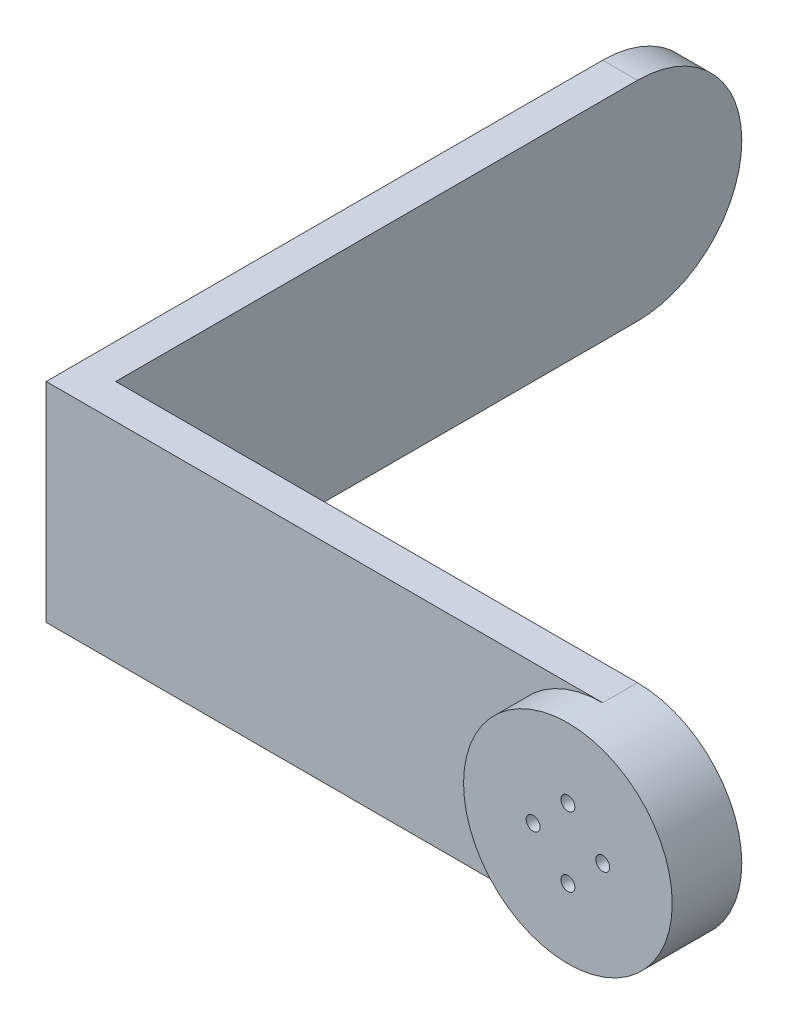
ISO-10303-21;
HEADER;
FILE_DESCRIPTION(('STEP AP214'),'2;1');
FILE_NAME('part.step','',(''),(''),'','','');
FILE_SCHEMA(('AUTOMOTIVE_DESIGN { 1 0 10303 214 1 1 1 1 }'));
ENDSEC;
DATA;
#1=APPLICATION_CONTEXT('core data for automotive mechanical design processes');
#2=APPLICATION_PROTOCOL_DEFINITION('international standard','automotive_design',2000,#1);
#3=PRODUCT_CONTEXT('',#1,'mechanical');
#4=PRODUCT('Part','Part','',(#3));
#5=PRODUCT_RELATED_PRODUCT_CATEGORY('part','',(#4));
#6=PRODUCT_DEFINITION_FORMATION('','',#4);
#7=PRODUCT_DEFINITION_CONTEXT('part definition',#1,'design');
#8=PRODUCT_DEFINITION('design','',#6,#7);
#9=PRODUCT_DEFINITION_SHAPE('','',#8);
#10=(LENGTH_UNIT() NAMED_UNIT(*) SI_UNIT(.MILLI.,.METRE.));
#11=(NAMED_UNIT(*) PLANE_ANGLE_UNIT() SI_UNIT($,.RADIAN.));
#12=(NAMED_UNIT(*) SI_UNIT($,.STERADIAN.) SOLID_ANGLE_UNIT());
#13=UNCERTAINTY_MEASURE_WITH_UNIT(LENGTH_MEASURE(1.E-05),#10,'distance_accuracy_value','');
#14=(GEOMETRIC_REPRESENTATION_CONTEXT(3) GLOBAL_UNCERTAINTY_ASSIGNED_CONTEXT((#13)) GLOBAL_UNIT_ASSIGNED_CONTEXT((#10,
#11,#12)) REPRESENTATION_CONTEXT('',''));
#15=CARTESIAN_POINT('',(0.,0.,0.));
#16=DIRECTION('',(0.,0.,1.));
#17=DIRECTION('',(1.,0.,0.));
#18=AXIS2_PLACEMENT_3D('',#15,#16,#17);
#19=CARTESIAN_POINT('',(0.,0.,-5.));
#20=DIRECTION('',(0.,0.,1.));
#21=DIRECTION('',(1.,0.,0.));
#22=AXIS2_PLACEMENT_3D('',#19,#20,#21);
#23=PLANE('',#22);
#24=CARTESIAN_POINT('',(-5.,0.,-5.));
#25=DIRECTION('',(0.,0.,1.));
#26=DIRECTION('',(1.,0.,0.));
#27=AXIS2_PLACEMENT_3D('',#24,#25,#26);
#28=CIRCLE('',#27,1.);
#29=CARTESIAN_POINT('',(-4.,0.,-5.));
#30=VERTEX_POINT('',#29);
#31=EDGE_CURVE('E140',#30,#30,#28,.T.);
#32=ORIENTED_EDGE('',*,*,#31,.T.);
#33=EDGE_LOOP('',(#32));
#34=FACE_BOUND('',#33,.T.);
#35=CARTESIAN_POINT('',(0.,-5.,-5.));
#36=DIRECTION('',(0.,0.,1.));
#37=DIRECTION('',(1.,0.,0.));
#38=AXIS2_PLACEMENT_3D('',#35,#36,#37);
#39=CIRCLE('',#38,1.);
#40=CARTESIAN_POINT('',(1.,-5.,-5.));
#41=VERTEX_POINT('',#40);
#42=EDGE_CURVE('E149',#41,#41,#39,.T.);
#43=ORIENTED_EDGE('',*,*,#42,.T.);
#44=EDGE_LOOP('',(#43));
#45=FACE_BOUND('',#44,.T.);
#46=CARTESIAN_POINT('',(5.,0.,-5.));
#47=DIRECTION('',(0.,0.,1.));
#48=DIRECTION('',(1.,0.,0.));
#49=AXIS2_PLACEMENT_3D('',#46,#47,#48);
#50=CIRCLE('',#49,1.);
#51=CARTESIAN_POINT('',(6.,0.,-5.));
#52=VERTEX_POINT('',#51);
#53=EDGE_CURVE('E157',#52,#52,#50,.T.);
#54=ORIENTED_EDGE('',*,*,#53,.T.);
#55=EDGE_LOOP('',(#54));
#56=FACE_BOUND('',#55,.T.);
#57=CARTESIAN_POINT('',(0.,5.,-5.));
#58=DIRECTION('',(0.,0.,1.));
#59=DIRECTION('',(1.,0.,0.));
#60=AXIS2_PLACEMENT_3D('',#57,#58,#59);
#61=CIRCLE('',#60,1.);
#62=CARTESIAN_POINT('',(1.,5.,-5.));
#63=VERTEX_POINT('',#62);
#64=EDGE_CURVE('E92',#63,#63,#61,.T.);
#65=ORIENTED_EDGE('',*,*,#64,.T.);
#66=EDGE_LOOP('',(#65));
#67=FACE_BOUND('',#66,.T.);
#68=DIRECTION('',(0.,-1.,0.));
#69=VECTOR('',#68,1.);
#70=CARTESIAN_POINT('',(-75.,0.,-5.));
#71=LINE('',#70,#69);
#72=CARTESIAN_POINT('',(-75.,15.,-5.));
#73=VERTEX_POINT('',#72);
#74=CARTESIAN_POINT('',(-75.,-15.,-5.));
#75=VERTEX_POINT('',#74);
#76=EDGE_CURVE('E11',#73,#75,#71,.T.);
#77=ORIENTED_EDGE('',*,*,#76,.F.);
#78=DIRECTION('',(-1.,0.,0.));
#79=VECTOR('',#78,1.);
#80=CARTESIAN_POINT('',(0.,15.,-5.));
#81=LINE('',#80,#79);
#82=CARTESIAN_POINT('',(0.,15.,-5.));
#83=VERTEX_POINT('',#82);
#84=EDGE_CURVE('E123',#83,#73,#81,.T.);
#85=ORIENTED_EDGE('',*,*,#84,.F.);
#86=CARTESIAN_POINT('',(0.,0.,-5.));
#87=DIRECTION('',(0.,0.,1.));
#88=DIRECTION('',(1.,0.,0.));
#89=AXIS2_PLACEMENT_3D('',#86,#87,#88);
#90=CIRCLE('',#89,15.);
#91=CARTESIAN_POINT('',(0.,-15.,-5.));
#92=VERTEX_POINT('',#91);
#93=EDGE_CURVE('E113',#92,#83,#90,.T.);
#94=ORIENTED_EDGE('',*,*,#93,.F.);
#95=DIRECTION('',(-1.,0.,0.));
#96=VECTOR('',#95,1.);
#97=CARTESIAN_POINT('',(0.,-15.,-5.));
#98=LINE('',#97,#96);
#99=EDGE_CURVE('E108',#92,#75,#98,.T.);
#100=ORIENTED_EDGE('',*,*,#99,.T.);
#101=EDGE_LOOP('',(#77,#85,#94,#100));
#102=FACE_BOUND('',#101,.T.);
#103=ADVANCED_FACE('F41',(#34,#45,#56,#67,#102),#23,.F.);
#104=CARTESIAN_POINT('',(0.,0.,5.));
#105=DIRECTION('',(0.,0.,-1.));
#106=DIRECTION('',(-1.,0.,0.));
#107=AXIS2_PLACEMENT_3D('',#104,#105,#106);
#108=CYLINDRICAL_SURFACE('',#107,15.);
#109=CARTESIAN_POINT('',(0.,0.,5.));
#110=DIRECTION('',(0.,0.,1.));
#111=DIRECTION('',(1.,0.,0.));
#112=AXIS2_PLACEMENT_3D('',#109,#110,#111);
#113=CIRCLE('',#112,15.);
#114=CARTESIAN_POINT('',(15.,0.,5.));
#115=VERTEX_POINT('',#114);
#116=EDGE_CURVE('E50',#115,#115,#113,.T.);
#117=ORIENTED_EDGE('',*,*,#116,.F.);
#118=EDGE_LOOP('',(#117));
#119=FACE_BOUND('',#118,.T.);
#120=CARTESIAN_POINT('',(0.,0.,0.));
#121=DIRECTION('',(0.,0.,1.));
#122=DIRECTION('',(1.,0.,0.));
#123=AXIS2_PLACEMENT_3D('',#120,#121,#122);
#124=CIRCLE('',#123,15.);
#125=CARTESIAN_POINT('',(0.,15.,0.));
#126=VERTEX_POINT('',#125);
#127=CARTESIAN_POINT('',(0.,-15.,0.));
#128=VERTEX_POINT('',#127);
#129=EDGE_CURVE('E103',#126,#128,#124,.T.);
#130=ORIENTED_EDGE('',*,*,#129,.T.);
#131=DIRECTION('',(0.,0.,1.));
#132=VECTOR('',#131,1.);
#133=CARTESIAN_POINT('',(0.,-15.,-5.));
#134=LINE('',#133,#132);
#135=EDGE_CURVE('E86',#92,#128,#134,.T.);
#136=ORIENTED_EDGE('',*,*,#135,.F.);
#137=ORIENTED_EDGE('',*,*,#93,.T.);
#138=DIRECTION('',(0.,0.,1.));
#139=VECTOR('',#138,1.);
#140=CARTESIAN_POINT('',(0.,15.,-5.));
#141=LINE('',#140,#139);
#142=EDGE_CURVE('E62',#83,#126,#141,.T.);
#143=ORIENTED_EDGE('',*,*,#142,.T.);
#144=EDGE_LOOP('',(#130,#136,#137,#143));
#145=FACE_BOUND('',#144,.T.);
#146=ADVANCED_FACE('F43',(#119,#145),#108,.T.);
#147=CARTESIAN_POINT('',(0.,0.,5.));
#148=DIRECTION('',(0.,0.,1.));
#149=DIRECTION('',(1.,0.,0.));
#150=AXIS2_PLACEMENT_3D('',#147,#148,#149);
#151=PLANE('',#150);
#152=CARTESIAN_POINT('',(0.,5.,5.));
#153=DIRECTION('',(0.,0.,1.));
#154=DIRECTION('',(1.,0.,0.));
#155=AXIS2_PLACEMENT_3D('',#152,#153,#154);
#156=CIRCLE('',#155,1.);
#157=CARTESIAN_POINT('',(1.,5.,5.));
#158=VERTEX_POINT('',#157);
#159=EDGE_CURVE('E161',#158,#158,#156,.T.);
#160=ORIENTED_EDGE('',*,*,#159,.F.);
#161=EDGE_LOOP('',(#160));
#162=FACE_BOUND('',#161,.T.);
#163=CARTESIAN_POINT('',(5.,0.,5.));
#164=DIRECTION('',(0.,0.,1.));
#165=DIRECTION('',(1.,0.,0.));
#166=AXIS2_PLACEMENT_3D('',#163,#164,#165);
#167=CIRCLE('',#166,1.);
#168=CARTESIAN_POINT('',(6.,0.,5.));
#169=VERTEX_POINT('',#168);
#170=EDGE_CURVE('E153',#169,#169,#167,.T.);
#171=ORIENTED_EDGE('',*,*,#170,.F.);
#172=EDGE_LOOP('',(#171));
#173=FACE_BOUND('',#172,.T.);
#174=CARTESIAN_POINT('',(0.,-5.,5.));
#175=DIRECTION('',(0.,0.,1.));
#176=DIRECTION('',(1.,0.,0.));
#177=AXIS2_PLACEMENT_3D('',#174,#175,#176);
#178=CIRCLE('',#177,1.);
#179=CARTESIAN_POINT('',(1.,-5.,5.));
#180=VERTEX_POINT('',#179);
#181=EDGE_CURVE('E145',#180,#180,#178,.T.);
#182=ORIENTED_EDGE('',*,*,#181,.F.);
#183=EDGE_LOOP('',(#182));
#184=FACE_BOUND('',#183,.T.);
#185=CARTESIAN_POINT('',(-5.,0.,5.));
#186=DIRECTION('',(0.,0.,1.));
#187=DIRECTION('',(1.,0.,0.));
#188=AXIS2_PLACEMENT_3D('',#185,#186,#187);
#189=CIRCLE('',#188,1.);
#190=CARTESIAN_POINT('',(-4.,0.,5.));
#191=VERTEX_POINT('',#190);
#192=EDGE_CURVE('E136',#191,#191,#189,.T.);
#193=ORIENTED_EDGE('',*,*,#192,.F.);
#194=EDGE_LOOP('',(#193));
#195=FACE_BOUND('',#194,.T.);
#196=ORIENTED_EDGE('',*,*,#116,.T.);
#197=EDGE_LOOP('',(#196));
#198=FACE_BOUND('',#197,.T.);
#199=ADVANCED_FACE('F220',(#162,#173,#184,#195,#198),#151,.T.);
#200=CARTESIAN_POINT('',(0.,0.,0.));
#201=DIRECTION('',(0.,0.,1.));
#202=DIRECTION('',(1.,0.,0.));
#203=AXIS2_PLACEMENT_3D('',#200,#201,#202);
#204=PLANE('',#203);
#205=DIRECTION('',(0.,-1.,0.));
#206=VECTOR('',#205,1.);
#207=CARTESIAN_POINT('',(-80.,0.,0.));
#208=LINE('',#207,#206);
#209=CARTESIAN_POINT('',(-80.,15.,0.));
#210=VERTEX_POINT('',#209);
#211=CARTESIAN_POINT('',(-80.,-15.,0.));
#212=VERTEX_POINT('',#211);
#213=EDGE_CURVE('E99',#210,#212,#208,.T.);
#214=ORIENTED_EDGE('',*,*,#213,.T.);
#215=DIRECTION('',(-1.,0.,0.));
#216=VECTOR('',#215,1.);
#217=CARTESIAN_POINT('',(0.,-15.,0.));
#218=LINE('',#217,#216);
#219=EDGE_CURVE('E78',#128,#212,#218,.T.);
#220=ORIENTED_EDGE('',*,*,#219,.F.);
#221=ORIENTED_EDGE('',*,*,#129,.F.);
#222=DIRECTION('',(-1.,0.,0.));
#223=VECTOR('',#222,1.);
#224=CARTESIAN_POINT('',(0.,15.,0.));
#225=LINE('',#224,#223);
#226=EDGE_CURVE('E57',#126,#210,#225,.T.);
#227=ORIENTED_EDGE('',*,*,#226,.T.);
#228=EDGE_LOOP('',(#214,#220,#221,#227));
#229=FACE_BOUND('',#228,.T.);
#230=ADVANCED_FACE('F106',(#229),#204,.T.);
#231=CARTESIAN_POINT('',(0.,-15.,-5.));
#232=DIRECTION('',(0.,1.,0.));
#233=DIRECTION('',(-1.,0.,0.));
#234=AXIS2_PLACEMENT_3D('',#231,#232,#233);
#235=PLANE('',#234);
#236=DIRECTION('',(0.,0.,1.));
#237=VECTOR('',#236,1.);
#238=CARTESIAN_POINT('',(-80.,-15.,-5.));
#239=LINE('',#238,#237);
#240=CARTESIAN_POINT('',(-80.,-15.,-80.));
#241=VERTEX_POINT('',#240);
#242=EDGE_CURVE('E83',#241,#212,#239,.T.);
#243=ORIENTED_EDGE('',*,*,#242,.F.);
#244=DIRECTION('',(-1.,0.,0.));
#245=VECTOR('',#244,1.);
#246=CARTESIAN_POINT('',(-75.,-15.,-80.));
#247=LINE('',#246,#245);
#248=CARTESIAN_POINT('',(-75.,-15.,-80.));
#249=VERTEX_POINT('',#248);
#250=EDGE_CURVE('E141',#249,#241,#247,.T.);
#251=ORIENTED_EDGE('',*,*,#250,.F.);
#252=DIRECTION('',(0.,0.,1.));
#253=VECTOR('',#252,1.);
#254=CARTESIAN_POINT('',(-75.,-15.,-80.));
#255=LINE('',#254,#253);
#256=EDGE_CURVE('E177',#249,#75,#255,.T.);
#257=ORIENTED_EDGE('',*,*,#256,.T.);
#258=ORIENTED_EDGE('',*,*,#99,.F.);
#259=ORIENTED_EDGE('',*,*,#135,.T.);
#260=ORIENTED_EDGE('',*,*,#219,.T.);
#261=EDGE_LOOP('',(#243,#251,#257,#258,#259,#260));
#262=FACE_BOUND('',#261,.T.);
#263=ADVANCED_FACE('F80',(#262),#235,.F.);
#264=CARTESIAN_POINT('',(-80.,0.,-5.));
#265=DIRECTION('',(-1.,0.,0.));
#266=DIRECTION('',(0.,0.,1.));
#267=AXIS2_PLACEMENT_3D('',#264,#265,#266);
#268=PLANE('',#267);
#269=ORIENTED_EDGE('',*,*,#213,.F.);
#270=DIRECTION('',(0.,0.,1.));
#271=VECTOR('',#270,1.);
#272=CARTESIAN_POINT('',(-80.,15.,-5.));
#273=LINE('',#272,#271);
#274=CARTESIAN_POINT('',(-80.,15.,-80.));
#275=VERTEX_POINT('',#274);
#276=EDGE_CURVE('E104',#275,#210,#273,.T.);
#277=ORIENTED_EDGE('',*,*,#276,.F.);
#278=CARTESIAN_POINT('',(-80.,0.,-80.));
#279=DIRECTION('',(1.,0.,0.));
#280=DIRECTION('',(0.,0.,-1.));
#281=AXIS2_PLACEMENT_3D('',#278,#279,#280);
#282=CIRCLE('',#281,15.);
#283=EDGE_CURVE('E101',#241,#275,#282,.T.);
#284=ORIENTED_EDGE('',*,*,#283,.F.);
#285=ORIENTED_EDGE('',*,*,#242,.T.);
#286=EDGE_LOOP('',(#269,#277,#284,#285));
#287=FACE_BOUND('',#286,.T.);
#288=ADVANCED_FACE('F97',(#287),#268,.T.);
#289=CARTESIAN_POINT('',(0.,15.,-5.));
#290=DIRECTION('',(0.,1.,0.));
#291=DIRECTION('',(-1.,0.,0.));
#292=AXIS2_PLACEMENT_3D('',#289,#290,#291);
#293=PLANE('',#292);
#294=ORIENTED_EDGE('',*,*,#276,.T.);
#295=ORIENTED_EDGE('',*,*,#226,.F.);
#296=ORIENTED_EDGE('',*,*,#142,.F.);
#297=ORIENTED_EDGE('',*,*,#84,.T.);
#298=DIRECTION('',(0.,0.,1.));
#299=VECTOR('',#298,1.);
#300=CARTESIAN_POINT('',(-75.,15.,-80.));
#301=LINE('',#300,#299);
#302=CARTESIAN_POINT('',(-75.,15.,-80.));
#303=VERTEX_POINT('',#302);
#304=EDGE_CURVE('E181',#303,#73,#301,.T.);
#305=ORIENTED_EDGE('',*,*,#304,.F.);
#306=DIRECTION('',(-1.,0.,0.));
#307=VECTOR('',#306,1.);
#308=CARTESIAN_POINT('',(-75.,15.,-80.));
#309=LINE('',#308,#307);
#310=EDGE_CURVE('E168',#303,#275,#309,.T.);
#311=ORIENTED_EDGE('',*,*,#310,.T.);
#312=EDGE_LOOP('',(#294,#295,#296,#297,#305,#311));
#313=FACE_BOUND('',#312,.T.);
#314=ADVANCED_FACE('F195',(#313),#293,.T.);
#315=CARTESIAN_POINT('',(-5.,0.,-5.));
#316=DIRECTION('',(0.,0.,1.));
#317=DIRECTION('',(1.,0.,0.));
#318=AXIS2_PLACEMENT_3D('',#315,#316,#317);
#319=CYLINDRICAL_SURFACE('',#318,1.);
#320=ORIENTED_EDGE('',*,*,#31,.F.);
#321=EDGE_LOOP('',(#320));
#322=FACE_BOUND('',#321,.T.);
#323=ORIENTED_EDGE('',*,*,#192,.T.);
#324=EDGE_LOOP('',(#323));
#325=FACE_BOUND('',#324,.T.);
#326=ADVANCED_FACE('F225',(#322,#325),#319,.F.);
#327=CARTESIAN_POINT('',(0.,-5.,-5.));
#328=DIRECTION('',(0.,0.,1.));
#329=DIRECTION('',(1.,0.,0.));
#330=AXIS2_PLACEMENT_3D('',#327,#328,#329);
#331=CYLINDRICAL_SURFACE('',#330,1.);
#332=ORIENTED_EDGE('',*,*,#42,.F.);
#333=EDGE_LOOP('',(#332));
#334=FACE_BOUND('',#333,.T.);
#335=ORIENTED_EDGE('',*,*,#181,.T.);
#336=EDGE_LOOP('',(#335));
#337=FACE_BOUND('',#336,.T.);
#338=ADVANCED_FACE('F249',(#334,#337),#331,.F.);
#339=CARTESIAN_POINT('',(5.,0.,-5.));
#340=DIRECTION('',(0.,0.,1.));
#341=DIRECTION('',(1.,0.,0.));
#342=AXIS2_PLACEMENT_3D('',#339,#340,#341);
#343=CYLINDRICAL_SURFACE('',#342,1.);
#344=ORIENTED_EDGE('',*,*,#53,.F.);
#345=EDGE_LOOP('',(#344));
#346=FACE_BOUND('',#345,.T.);
#347=ORIENTED_EDGE('',*,*,#170,.T.);
#348=EDGE_LOOP('',(#347));
#349=FACE_BOUND('',#348,.T.);
#350=ADVANCED_FACE('F254',(#346,#349),#343,.F.);
#351=CARTESIAN_POINT('',(0.,5.,-5.));
#352=DIRECTION('',(0.,0.,1.));
#353=DIRECTION('',(1.,0.,0.));
#354=AXIS2_PLACEMENT_3D('',#351,#352,#353);
#355=CYLINDRICAL_SURFACE('',#354,1.);
#356=ORIENTED_EDGE('',*,*,#64,.F.);
#357=EDGE_LOOP('',(#356));
#358=FACE_BOUND('',#357,.T.);
#359=ORIENTED_EDGE('',*,*,#159,.T.);
#360=EDGE_LOOP('',(#359));
#361=FACE_BOUND('',#360,.T.);
#362=ADVANCED_FACE('F211',(#358,#361),#355,.F.);
#363=CARTESIAN_POINT('',(-75.,0.,-80.));
#364=DIRECTION('',(-1.,0.,0.));
#365=DIRECTION('',(0.,0.,-1.));
#366=AXIS2_PLACEMENT_3D('',#363,#364,#365);
#367=PLANE('',#366);
#368=ORIENTED_EDGE('',*,*,#304,.T.);
#369=ORIENTED_EDGE('',*,*,#76,.T.);
#370=ORIENTED_EDGE('',*,*,#256,.F.);
#371=CARTESIAN_POINT('',(-75.,0.,-80.));
#372=DIRECTION('',(1.,0.,0.));
#373=DIRECTION('',(0.,0.,-1.));
#374=AXIS2_PLACEMENT_3D('',#371,#372,#373);
#375=CIRCLE('',#374,15.);
#376=EDGE_CURVE('E172',#249,#303,#375,.T.);
#377=ORIENTED_EDGE('',*,*,#376,.T.);
#378=EDGE_LOOP('',(#368,#369,#370,#377));
#379=FACE_BOUND('',#378,.T.);
#380=ADVANCED_FACE('F200',(#379),#367,.F.);
#381=CARTESIAN_POINT('',(-75.,0.,-80.));
#382=DIRECTION('',(-1.,0.,0.));
#383=DIRECTION('',(0.,0.,1.));
#384=AXIS2_PLACEMENT_3D('',#381,#382,#383);
#385=CYLINDRICAL_SURFACE('',#384,15.);
#386=ORIENTED_EDGE('',*,*,#283,.T.);
#387=ORIENTED_EDGE('',*,*,#310,.F.);
#388=ORIENTED_EDGE('',*,*,#376,.F.);
#389=ORIENTED_EDGE('',*,*,#250,.T.);
#390=EDGE_LOOP('',(#386,#387,#388,#389));
#391=FACE_BOUND('',#390,.T.);
#392=ADVANCED_FACE('F202',(#391),#385,.T.);
#393=CLOSED_SHELL('',(#103,#146,#199,#230,#263,#288,#314,#326,#338,#350,#362,#380,#392));
#394=MANIFOLD_SOLID_BREP('B2',#393);
#395=ADVANCED_BREP_SHAPE_REPRESENTATION('',(#18,#394),#14);
#396=SHAPE_DEFINITION_REPRESENTATION(#9,#395);
ENDSEC;
END-ISO-10303-21;
